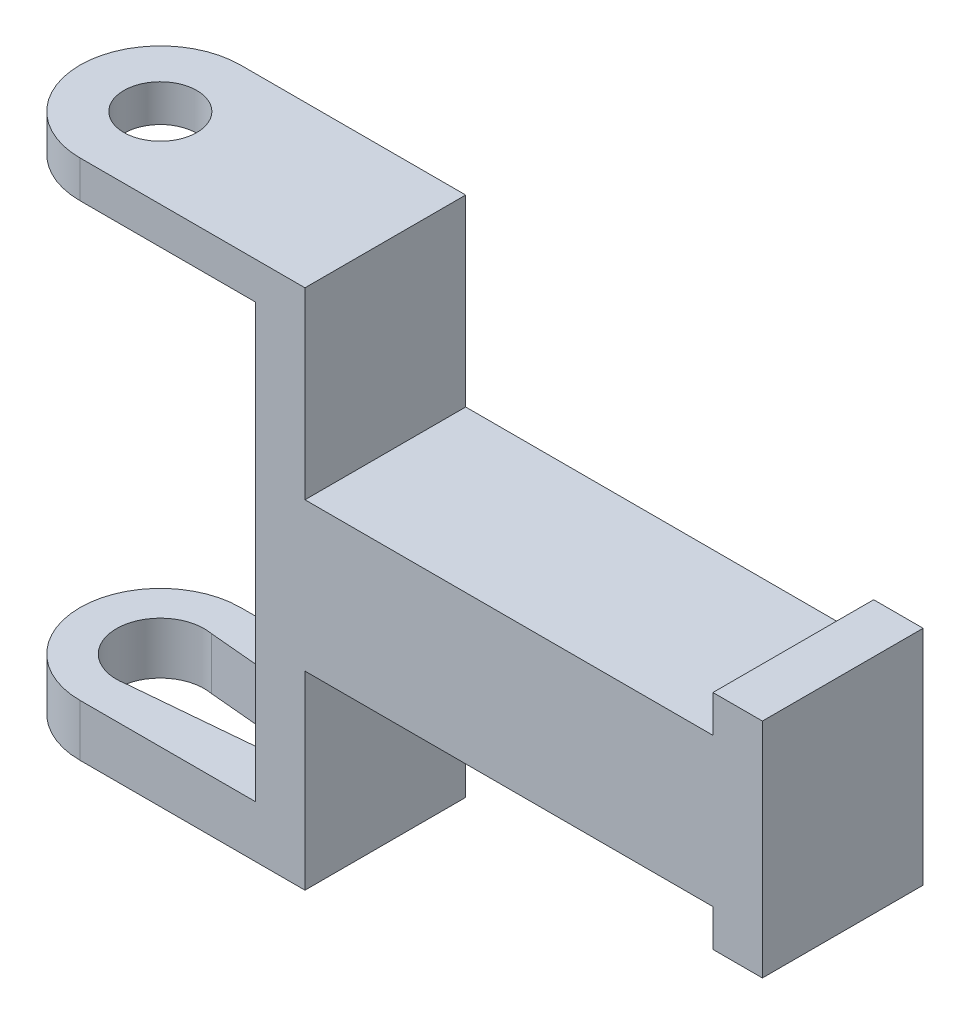
ISO-10303-21;
HEADER;
FILE_DESCRIPTION(('STEP AP214'),'2;1');
FILE_NAME('part.step','',(''),(''),'','','');
FILE_SCHEMA(('AUTOMOTIVE_DESIGN { 1 0 10303 214 1 1 1 1 }'));
ENDSEC;
DATA;
#1=APPLICATION_CONTEXT('core data for automotive mechanical design processes');
#2=APPLICATION_PROTOCOL_DEFINITION('international standard','automotive_design',2000,#1);
#3=PRODUCT_CONTEXT('',#1,'mechanical');
#4=PRODUCT('Part','Part','',(#3));
#5=PRODUCT_RELATED_PRODUCT_CATEGORY('part','',(#4));
#6=PRODUCT_DEFINITION_FORMATION('','',#4);
#7=PRODUCT_DEFINITION_CONTEXT('part definition',#1,'design');
#8=PRODUCT_DEFINITION('design','',#6,#7);
#9=PRODUCT_DEFINITION_SHAPE('','',#8);
#10=(LENGTH_UNIT() NAMED_UNIT(*) SI_UNIT(.MILLI.,.METRE.));
#11=(NAMED_UNIT(*) PLANE_ANGLE_UNIT() SI_UNIT($,.RADIAN.));
#12=(NAMED_UNIT(*) SI_UNIT($,.STERADIAN.) SOLID_ANGLE_UNIT());
#13=UNCERTAINTY_MEASURE_WITH_UNIT(LENGTH_MEASURE(1.E-05),#10,'distance_accuracy_value','');
#14=(GEOMETRIC_REPRESENTATION_CONTEXT(3) GLOBAL_UNCERTAINTY_ASSIGNED_CONTEXT((#13)) GLOBAL_UNIT_ASSIGNED_CONTEXT((#10,
#11,#12)) REPRESENTATION_CONTEXT('',''));
#15=CARTESIAN_POINT('',(0.,0.,0.));
#16=DIRECTION('',(0.,0.,1.));
#17=DIRECTION('',(1.,0.,0.));
#18=AXIS2_PLACEMENT_3D('',#15,#16,#17);
#19=CARTESIAN_POINT('',(-1.,0.,0.));
#20=DIRECTION('',(-1.,0.,0.));
#21=DIRECTION('',(0.,0.,1.));
#22=AXIS2_PLACEMENT_3D('',#19,#20,#21);
#23=PLANE('',#22);
#24=DIRECTION('',(0.,0.,-1.));
#25=VECTOR('',#24,1.);
#26=CARTESIAN_POINT('',(-1.,-74.,0.));
#27=LINE('',#26,#25);
#28=CARTESIAN_POINT('',(-1.,-74.,6.5));
#29=VERTEX_POINT('',#28);
#30=CARTESIAN_POINT('',(-1.,-74.,-6.5));
#31=VERTEX_POINT('',#30);
#32=EDGE_CURVE('E48',#29,#31,#27,.T.);
#33=ORIENTED_EDGE('',*,*,#32,.F.);
#34=DIRECTION('',(0.,-1.,0.));
#35=VECTOR('',#34,1.);
#36=CARTESIAN_POINT('',(-1.,-89.35,6.5));
#37=LINE('',#36,#35);
#38=CARTESIAN_POINT('',(-1.,-89.35,6.5));
#39=VERTEX_POINT('',#38);
#40=EDGE_CURVE('E324',#29,#39,#37,.T.);
#41=ORIENTED_EDGE('',*,*,#40,.T.);
#42=DIRECTION('',(0.,0.,-1.));
#43=VECTOR('',#42,1.);
#44=CARTESIAN_POINT('',(-1.,-89.35,6.5));
#45=LINE('',#44,#43);
#46=CARTESIAN_POINT('',(-1.,-89.35,-6.5));
#47=VERTEX_POINT('',#46);
#48=EDGE_CURVE('E323',#39,#47,#45,.T.);
#49=ORIENTED_EDGE('',*,*,#48,.T.);
#50=DIRECTION('',(0.,1.,0.));
#51=VECTOR('',#50,1.);
#52=CARTESIAN_POINT('',(-1.,-89.35,-6.5));
#53=LINE('',#52,#51);
#54=EDGE_CURVE('E328',#47,#31,#53,.T.);
#55=ORIENTED_EDGE('',*,*,#54,.T.);
#56=EDGE_LOOP('',(#33,#41,#49,#55));
#57=FACE_BOUND('',#56,.T.);
#58=ADVANCED_FACE('F39',(#57),#23,.F.);
#59=DIRECTION('',(0.,0.,1.));
#60=VECTOR('',#59,1.);
#61=CARTESIAN_POINT('',(-1.,-62.,0.));
#62=LINE('',#61,#60);
#63=CARTESIAN_POINT('',(-1.,-62.,-6.5));
#64=VERTEX_POINT('',#63);
#65=CARTESIAN_POINT('',(-1.,-62.,6.5));
#66=VERTEX_POINT('',#65);
#67=EDGE_CURVE('E366',#64,#66,#62,.T.);
#68=ORIENTED_EDGE('',*,*,#67,.F.);
#69=CARTESIAN_POINT('',(-1.,-47.15,-6.5));
#70=VERTEX_POINT('',#69);
#71=EDGE_CURVE('E327',#64,#70,#53,.T.);
#72=ORIENTED_EDGE('',*,*,#71,.T.);
#73=DIRECTION('',(0.,0.,1.));
#74=VECTOR('',#73,1.);
#75=CARTESIAN_POINT('',(-1.,-47.15,6.5));
#76=LINE('',#75,#74);
#77=CARTESIAN_POINT('',(-1.,-47.15,6.5));
#78=VERTEX_POINT('',#77);
#79=EDGE_CURVE('E332',#70,#78,#76,.T.);
#80=ORIENTED_EDGE('',*,*,#79,.T.);
#81=EDGE_CURVE('E319',#78,#66,#37,.T.);
#82=ORIENTED_EDGE('',*,*,#81,.T.);
#83=EDGE_LOOP('',(#68,#72,#80,#82));
#84=FACE_BOUND('',#83,.T.);
#85=ADVANCED_FACE('F386',(#84),#23,.F.);
#86=CARTESIAN_POINT('',(-5.,0.,0.));
#87=DIRECTION('',(-1.,0.,0.));
#88=DIRECTION('',(0.,0.,1.));
#89=AXIS2_PLACEMENT_3D('',#86,#87,#88);
#90=PLANE('',#89);
#91=DIRECTION('',(0.,0.,1.));
#92=VECTOR('',#91,1.);
#93=CARTESIAN_POINT('',(-5.,-50.15,0.));
#94=LINE('',#93,#92);
#95=CARTESIAN_POINT('',(-5.,-50.15,-6.5));
#96=VERTEX_POINT('',#95);
#97=CARTESIAN_POINT('',(-5.,-50.15,6.5));
#98=VERTEX_POINT('',#97);
#99=EDGE_CURVE('E254',#96,#98,#94,.T.);
#100=ORIENTED_EDGE('',*,*,#99,.F.);
#101=DIRECTION('',(0.,1.,0.));
#102=VECTOR('',#101,1.);
#103=CARTESIAN_POINT('',(-5.,-89.35,-6.5));
#104=LINE('',#103,#102);
#105=CARTESIAN_POINT('',(-5.,-85.15,-6.5));
#106=VERTEX_POINT('',#105);
#107=EDGE_CURVE('E338',#106,#96,#104,.T.);
#108=ORIENTED_EDGE('',*,*,#107,.F.);
#109=DIRECTION('',(0.,0.,1.));
#110=VECTOR('',#109,1.);
#111=CARTESIAN_POINT('',(-5.,-85.15,0.));
#112=LINE('',#111,#110);
#113=CARTESIAN_POINT('',(-5.,-85.15,6.5));
#114=VERTEX_POINT('',#113);
#115=EDGE_CURVE('E354',#106,#114,#112,.T.);
#116=ORIENTED_EDGE('',*,*,#115,.T.);
#117=DIRECTION('',(0.,-1.,0.));
#118=VECTOR('',#117,1.);
#119=CARTESIAN_POINT('',(-5.,-89.35,6.5));
#120=LINE('',#119,#118);
#121=EDGE_CURVE('E318',#98,#114,#120,.T.);
#122=ORIENTED_EDGE('',*,*,#121,.F.);
#123=EDGE_LOOP('',(#100,#108,#116,#122));
#124=FACE_BOUND('',#123,.T.);
#125=ADVANCED_FACE('F442',(#124),#90,.T.);
#126=CARTESIAN_POINT('',(-1.,-89.35,6.5));
#127=DIRECTION('',(0.,0.,-1.));
#128=DIRECTION('',(-1.,0.,0.));
#129=AXIS2_PLACEMENT_3D('',#126,#127,#128);
#130=PLANE('',#129);
#131=DIRECTION('',(-1.,0.,0.));
#132=VECTOR('',#131,1.);
#133=CARTESIAN_POINT('',(36.,-74.,6.5));
#134=LINE('',#133,#132);
#135=CARTESIAN_POINT('',(32.,-74.,6.5));
#136=VERTEX_POINT('',#135);
#137=EDGE_CURVE('E221',#136,#29,#134,.T.);
#138=ORIENTED_EDGE('',*,*,#137,.F.);
#139=DIRECTION('',(0.,-1.,0.));
#140=VECTOR('',#139,1.);
#141=CARTESIAN_POINT('',(32.,-77.,6.5));
#142=LINE('',#141,#140);
#143=CARTESIAN_POINT('',(32.,-77.,6.5));
#144=VERTEX_POINT('',#143);
#145=EDGE_CURVE('E55',#136,#144,#142,.T.);
#146=ORIENTED_EDGE('',*,*,#145,.T.);
#147=DIRECTION('',(-1.,0.,0.));
#148=VECTOR('',#147,1.);
#149=CARTESIAN_POINT('',(36.,-77.,6.5));
#150=LINE('',#149,#148);
#151=CARTESIAN_POINT('',(36.,-77.,6.5));
#152=VERTEX_POINT('',#151);
#153=EDGE_CURVE('E194',#152,#144,#150,.T.);
#154=ORIENTED_EDGE('',*,*,#153,.F.);
#155=DIRECTION('',(0.,-1.,0.));
#156=VECTOR('',#155,1.);
#157=CARTESIAN_POINT('',(36.,-74.,6.5));
#158=LINE('',#157,#156);
#159=CARTESIAN_POINT('',(36.,-59.,6.5));
#160=VERTEX_POINT('',#159);
#161=EDGE_CURVE('E176',#160,#152,#158,.T.);
#162=ORIENTED_EDGE('',*,*,#161,.F.);
#163=DIRECTION('',(-1.,0.,0.));
#164=VECTOR('',#163,1.);
#165=CARTESIAN_POINT('',(36.,-59.,6.5));
#166=LINE('',#165,#164);
#167=CARTESIAN_POINT('',(32.,-59.,6.5));
#168=VERTEX_POINT('',#167);
#169=EDGE_CURVE('E411',#160,#168,#166,.T.);
#170=ORIENTED_EDGE('',*,*,#169,.T.);
#171=CARTESIAN_POINT('',(32.,-62.,6.5));
#172=VERTEX_POINT('',#171);
#173=EDGE_CURVE('E414',#168,#172,#142,.T.);
#174=ORIENTED_EDGE('',*,*,#173,.T.);
#175=DIRECTION('',(-1.,0.,0.));
#176=VECTOR('',#175,1.);
#177=CARTESIAN_POINT('',(36.,-62.,6.5));
#178=LINE('',#177,#176);
#179=EDGE_CURVE('E212',#172,#66,#178,.T.);
#180=ORIENTED_EDGE('',*,*,#179,.T.);
#181=ORIENTED_EDGE('',*,*,#81,.F.);
#182=DIRECTION('',(-1.,0.,0.));
#183=VECTOR('',#182,1.);
#184=CARTESIAN_POINT('',(-1.,-47.15,6.5));
#185=LINE('',#184,#183);
#186=CARTESIAN_POINT('',(-19.2,-47.15,6.5));
#187=VERTEX_POINT('',#186);
#188=EDGE_CURVE('E335',#78,#187,#185,.T.);
#189=ORIENTED_EDGE('',*,*,#188,.T.);
#190=DIRECTION('',(0.,-1.,0.));
#191=VECTOR('',#190,1.);
#192=CARTESIAN_POINT('',(-19.2,-47.15,6.5));
#193=LINE('',#192,#191);
#194=CARTESIAN_POINT('',(-19.2,-50.15,6.5));
#195=VERTEX_POINT('',#194);
#196=EDGE_CURVE('E251',#187,#195,#193,.T.);
#197=ORIENTED_EDGE('',*,*,#196,.T.);
#198=DIRECTION('',(1.,0.,0.));
#199=VECTOR('',#198,1.);
#200=CARTESIAN_POINT('',(-19.2,-50.15,6.5));
#201=LINE('',#200,#199);
#202=EDGE_CURVE('E237',#195,#98,#201,.T.);
#203=ORIENTED_EDGE('',*,*,#202,.T.);
#204=ORIENTED_EDGE('',*,*,#121,.T.);
#205=DIRECTION('',(1.,0.,0.));
#206=VECTOR('',#205,1.);
#207=CARTESIAN_POINT('',(-19.2,-85.15,6.5));
#208=LINE('',#207,#206);
#209=CARTESIAN_POINT('',(-19.2,-85.15,6.5));
#210=VERTEX_POINT('',#209);
#211=EDGE_CURVE('E301',#210,#114,#208,.T.);
#212=ORIENTED_EDGE('',*,*,#211,.F.);
#213=DIRECTION('',(0.,-1.,0.));
#214=VECTOR('',#213,1.);
#215=CARTESIAN_POINT('',(-19.2,-85.15,6.5));
#216=LINE('',#215,#214);
#217=CARTESIAN_POINT('',(-19.2,-89.35,6.5));
#218=VERTEX_POINT('',#217);
#219=EDGE_CURVE('E315',#210,#218,#216,.T.);
#220=ORIENTED_EDGE('',*,*,#219,.T.);
#221=DIRECTION('',(-1.,0.,0.));
#222=VECTOR('',#221,1.);
#223=CARTESIAN_POINT('',(-1.,-89.35,6.5));
#224=LINE('',#223,#222);
#225=EDGE_CURVE('E350',#39,#218,#224,.T.);
#226=ORIENTED_EDGE('',*,*,#225,.F.);
#227=ORIENTED_EDGE('',*,*,#40,.F.);
#228=EDGE_LOOP('',(#138,#146,#154,#162,#170,#174,#180,#181,#189,#197,#203,#204,#212,#220,#226,#227));
#229=FACE_BOUND('',#228,.T.);
#230=ADVANCED_FACE('F41',(#229),#130,.F.);
#231=CARTESIAN_POINT('',(-1.,-89.35,6.5));
#232=DIRECTION('',(0.,1.,0.));
#233=DIRECTION('',(0.,0.,1.));
#234=AXIS2_PLACEMENT_3D('',#231,#232,#233);
#235=PLANE('',#234);
#236=DIRECTION('',(0.,0.,-1.));
#237=VECTOR('',#236,1.);
#238=CARTESIAN_POINT('',(-6.5,-89.35,2.40328140539589));
#239=LINE('',#238,#237);
#240=CARTESIAN_POINT('',(-6.5,-89.35,2.40328140539589));
#241=VERTEX_POINT('',#240);
#242=CARTESIAN_POINT('',(-6.5,-89.35,-2.40328140539589));
#243=VERTEX_POINT('',#242);
#244=EDGE_CURVE('E263',#241,#243,#239,.T.);
#245=ORIENTED_EDGE('',*,*,#244,.T.);
#246=DIRECTION('',(-0.995948362239352,0.,-0.0899269689956986));
#247=VECTOR('',#246,1.);
#248=CARTESIAN_POINT('',(-6.5,-89.35,-2.40328140539589));
#249=LINE('',#248,#247);
#250=CARTESIAN_POINT('',(-18.5641054158038,-89.35,-3.49258329575545));
#251=VERTEX_POINT('',#250);
#252=EDGE_CURVE('E268',#243,#251,#249,.T.);
#253=ORIENTED_EDGE('',*,*,#252,.T.);
#254=CARTESIAN_POINT('',(-19.2,-89.35,0.));
#255=DIRECTION('',(0.,1.,0.));
#256=DIRECTION('',(0.,0.,1.));
#257=AXIS2_PLACEMENT_3D('',#254,#255,#256);
#258=CIRCLE('',#257,3.55);
#259=CARTESIAN_POINT('',(-18.5641054158038,-89.35,3.49258329575545));
#260=VERTEX_POINT('',#259);
#261=EDGE_CURVE('E289',#251,#260,#258,.T.);
#262=ORIENTED_EDGE('',*,*,#261,.T.);
#263=DIRECTION('',(0.995948362239352,0.,-0.0899269689956986));
#264=VECTOR('',#263,1.);
#265=CARTESIAN_POINT('',(-19.2,-89.35,3.55));
#266=LINE('',#265,#264);
#267=EDGE_CURVE('E259',#260,#241,#266,.T.);
#268=ORIENTED_EDGE('',*,*,#267,.T.);
#269=EDGE_LOOP('',(#245,#253,#262,#268));
#270=FACE_BOUND('',#269,.T.);
#271=ORIENTED_EDGE('',*,*,#225,.T.);
#272=CARTESIAN_POINT('',(-19.2,-89.35,0.));
#273=DIRECTION('',(0.,1.,0.));
#274=DIRECTION('',(0.,0.,1.));
#275=AXIS2_PLACEMENT_3D('',#272,#273,#274);
#276=CIRCLE('',#275,6.5);
#277=CARTESIAN_POINT('',(-19.2,-89.35,-6.5));
#278=VERTEX_POINT('',#277);
#279=EDGE_CURVE('E293',#278,#218,#276,.T.);
#280=ORIENTED_EDGE('',*,*,#279,.F.);
#281=DIRECTION('',(-1.,0.,0.));
#282=VECTOR('',#281,1.);
#283=CARTESIAN_POINT('',(-1.,-89.35,-6.5));
#284=LINE('',#283,#282);
#285=EDGE_CURVE('E347',#47,#278,#284,.T.);
#286=ORIENTED_EDGE('',*,*,#285,.F.);
#287=ORIENTED_EDGE('',*,*,#48,.F.);
#288=EDGE_LOOP('',(#271,#280,#286,#287));
#289=FACE_BOUND('',#288,.T.);
#290=ADVANCED_FACE('F454',(#270,#289),#235,.F.);
#291=CARTESIAN_POINT('',(-1.,-89.35,-6.5));
#292=DIRECTION('',(0.,0.,1.));
#293=DIRECTION('',(1.,0.,0.));
#294=AXIS2_PLACEMENT_3D('',#291,#292,#293);
#295=PLANE('',#294);
#296=DIRECTION('',(-1.,0.,0.));
#297=VECTOR('',#296,1.);
#298=CARTESIAN_POINT('',(36.,-62.,-6.5));
#299=LINE('',#298,#297);
#300=CARTESIAN_POINT('',(32.,-62.,-6.5));
#301=VERTEX_POINT('',#300);
#302=EDGE_CURVE('E215',#301,#64,#299,.T.);
#303=ORIENTED_EDGE('',*,*,#302,.F.);
#304=DIRECTION('',(0.,1.,0.));
#305=VECTOR('',#304,1.);
#306=CARTESIAN_POINT('',(32.,-77.,-6.5));
#307=LINE('',#306,#305);
#308=CARTESIAN_POINT('',(32.,-59.,-6.5));
#309=VERTEX_POINT('',#308);
#310=EDGE_CURVE('E63',#301,#309,#307,.T.);
#311=ORIENTED_EDGE('',*,*,#310,.T.);
#312=DIRECTION('',(-1.,0.,0.));
#313=VECTOR('',#312,1.);
#314=CARTESIAN_POINT('',(36.,-59.,-6.5));
#315=LINE('',#314,#313);
#316=CARTESIAN_POINT('',(36.,-59.,-6.5));
#317=VERTEX_POINT('',#316);
#318=EDGE_CURVE('E206',#317,#309,#315,.T.);
#319=ORIENTED_EDGE('',*,*,#318,.F.);
#320=DIRECTION('',(0.,1.,0.));
#321=VECTOR('',#320,1.);
#322=CARTESIAN_POINT('',(36.,-74.,-6.5));
#323=LINE('',#322,#321);
#324=CARTESIAN_POINT('',(36.,-77.,-6.5));
#325=VERTEX_POINT('',#324);
#326=EDGE_CURVE('E188',#325,#317,#323,.T.);
#327=ORIENTED_EDGE('',*,*,#326,.F.);
#328=DIRECTION('',(-1.,0.,0.));
#329=VECTOR('',#328,1.);
#330=CARTESIAN_POINT('',(36.,-77.,-6.5));
#331=LINE('',#330,#329);
#332=CARTESIAN_POINT('',(32.,-77.,-6.5));
#333=VERTEX_POINT('',#332);
#334=EDGE_CURVE('E196',#325,#333,#331,.T.);
#335=ORIENTED_EDGE('',*,*,#334,.T.);
#336=CARTESIAN_POINT('',(32.,-74.,-6.5));
#337=VERTEX_POINT('',#336);
#338=EDGE_CURVE('E405',#333,#337,#307,.T.);
#339=ORIENTED_EDGE('',*,*,#338,.T.);
#340=DIRECTION('',(-1.,0.,0.));
#341=VECTOR('',#340,1.);
#342=CARTESIAN_POINT('',(36.,-74.,-6.5));
#343=LINE('',#342,#341);
#344=EDGE_CURVE('E218',#337,#31,#343,.T.);
#345=ORIENTED_EDGE('',*,*,#344,.T.);
#346=ORIENTED_EDGE('',*,*,#54,.F.);
#347=ORIENTED_EDGE('',*,*,#285,.T.);
#348=DIRECTION('',(0.,-1.,0.));
#349=VECTOR('',#348,1.);
#350=CARTESIAN_POINT('',(-19.2,-85.15,-6.5));
#351=LINE('',#350,#349);
#352=CARTESIAN_POINT('',(-19.2,-85.15,-6.5));
#353=VERTEX_POINT('',#352);
#354=EDGE_CURVE('E311',#353,#278,#351,.T.);
#355=ORIENTED_EDGE('',*,*,#354,.F.);
#356=DIRECTION('',(-1.,0.,0.));
#357=VECTOR('',#356,1.);
#358=CARTESIAN_POINT('',(-19.2,-85.15,-6.5));
#359=LINE('',#358,#357);
#360=EDGE_CURVE('E308',#106,#353,#359,.T.);
#361=ORIENTED_EDGE('',*,*,#360,.F.);
#362=ORIENTED_EDGE('',*,*,#107,.T.);
#363=DIRECTION('',(-1.,0.,0.));
#364=VECTOR('',#363,1.);
#365=CARTESIAN_POINT('',(-19.2,-50.15,-6.5));
#366=LINE('',#365,#364);
#367=CARTESIAN_POINT('',(-19.2,-50.15,-6.5));
#368=VERTEX_POINT('',#367);
#369=EDGE_CURVE('E244',#96,#368,#366,.T.);
#370=ORIENTED_EDGE('',*,*,#369,.T.);
#371=DIRECTION('',(0.,-1.,0.));
#372=VECTOR('',#371,1.);
#373=CARTESIAN_POINT('',(-19.2,-47.15,-6.5));
#374=LINE('',#373,#372);
#375=CARTESIAN_POINT('',(-19.2,-47.15,-6.5));
#376=VERTEX_POINT('',#375);
#377=EDGE_CURVE('E247',#376,#368,#374,.T.);
#378=ORIENTED_EDGE('',*,*,#377,.F.);
#379=DIRECTION('',(-1.,0.,0.));
#380=VECTOR('',#379,1.);
#381=CARTESIAN_POINT('',(-1.,-47.15,-6.5));
#382=LINE('',#381,#380);
#383=EDGE_CURVE('E344',#70,#376,#382,.T.);
#384=ORIENTED_EDGE('',*,*,#383,.F.);
#385=ORIENTED_EDGE('',*,*,#71,.F.);
#386=EDGE_LOOP('',(#303,#311,#319,#327,#335,#339,#345,#346,#347,#355,#361,#362,#370,#378,#384,#385));
#387=FACE_BOUND('',#386,.T.);
#388=ADVANCED_FACE('F392',(#387),#295,.F.);
#389=CARTESIAN_POINT('',(-1.,-47.15,6.5));
#390=DIRECTION('',(0.,-1.,0.));
#391=DIRECTION('',(0.,0.,-1.));
#392=AXIS2_PLACEMENT_3D('',#389,#390,#391);
#393=PLANE('',#392);
#394=CARTESIAN_POINT('',(-19.2,-47.15,0.));
#395=DIRECTION('',(0.,1.,0.));
#396=DIRECTION('',(0.,0.,1.));
#397=AXIS2_PLACEMENT_3D('',#394,#395,#396);
#398=CIRCLE('',#397,2.95);
#399=CARTESIAN_POINT('',(-19.2,-47.15,2.95));
#400=VERTEX_POINT('',#399);
#401=EDGE_CURVE('E224',#400,#400,#398,.T.);
#402=ORIENTED_EDGE('',*,*,#401,.F.);
#403=EDGE_LOOP('',(#402));
#404=FACE_BOUND('',#403,.T.);
#405=ORIENTED_EDGE('',*,*,#383,.T.);
#406=CARTESIAN_POINT('',(-19.2,-47.15,0.));
#407=DIRECTION('',(0.,1.,0.));
#408=DIRECTION('',(0.,0.,1.));
#409=AXIS2_PLACEMENT_3D('',#406,#407,#408);
#410=CIRCLE('',#409,6.5);
#411=EDGE_CURVE('E233',#376,#187,#410,.T.);
#412=ORIENTED_EDGE('',*,*,#411,.T.);
#413=ORIENTED_EDGE('',*,*,#188,.F.);
#414=ORIENTED_EDGE('',*,*,#79,.F.);
#415=EDGE_LOOP('',(#405,#412,#413,#414));
#416=FACE_BOUND('',#415,.T.);
#417=ADVANCED_FACE('F395',(#404,#416),#393,.F.);
#418=CARTESIAN_POINT('',(0.,-85.15,0.));
#419=DIRECTION('',(0.,-1.,0.));
#420=DIRECTION('',(0.,0.,-1.));
#421=AXIS2_PLACEMENT_3D('',#418,#419,#420);
#422=PLANE('',#421);
#423=CARTESIAN_POINT('',(-19.2,-85.15,0.));
#424=DIRECTION('',(0.,1.,0.));
#425=DIRECTION('',(0.,0.,1.));
#426=AXIS2_PLACEMENT_3D('',#423,#424,#425);
#427=CIRCLE('',#426,3.55);
#428=CARTESIAN_POINT('',(-18.5641054158038,-85.15,-3.49258329575545));
#429=VERTEX_POINT('',#428);
#430=CARTESIAN_POINT('',(-18.5641054158038,-85.15,3.49258329575545));
#431=VERTEX_POINT('',#430);
#432=EDGE_CURVE('E285',#429,#431,#427,.T.);
#433=ORIENTED_EDGE('',*,*,#432,.F.);
#434=DIRECTION('',(-0.995948362239352,0.,-0.0899269689956986));
#435=VECTOR('',#434,1.);
#436=CARTESIAN_POINT('',(-6.5,-85.15,-2.40328140539589));
#437=LINE('',#436,#435);
#438=CARTESIAN_POINT('',(-6.5,-85.15,-2.40328140539589));
#439=VERTEX_POINT('',#438);
#440=EDGE_CURVE('E264',#439,#429,#437,.T.);
#441=ORIENTED_EDGE('',*,*,#440,.F.);
#442=DIRECTION('',(0.,0.,-1.));
#443=VECTOR('',#442,1.);
#444=CARTESIAN_POINT('',(-6.5,-85.15,2.40328140539589));
#445=LINE('',#444,#443);
#446=CARTESIAN_POINT('',(-6.5,-85.15,2.40328140539589));
#447=VERTEX_POINT('',#446);
#448=EDGE_CURVE('E275',#447,#439,#445,.T.);
#449=ORIENTED_EDGE('',*,*,#448,.F.);
#450=DIRECTION('',(0.995948362239352,0.,-0.0899269689956986));
#451=VECTOR('',#450,1.);
#452=CARTESIAN_POINT('',(-19.2,-85.15,3.55));
#453=LINE('',#452,#451);
#454=EDGE_CURVE('E258',#431,#447,#453,.T.);
#455=ORIENTED_EDGE('',*,*,#454,.F.);
#456=EDGE_LOOP('',(#433,#441,#449,#455));
#457=FACE_BOUND('',#456,.T.);
#458=ORIENTED_EDGE('',*,*,#360,.T.);
#459=CARTESIAN_POINT('',(-19.2,-85.15,0.));
#460=DIRECTION('',(0.,1.,0.));
#461=DIRECTION('',(0.,0.,1.));
#462=AXIS2_PLACEMENT_3D('',#459,#460,#461);
#463=CIRCLE('',#462,6.5);
#464=EDGE_CURVE('E297',#353,#210,#463,.T.);
#465=ORIENTED_EDGE('',*,*,#464,.T.);
#466=ORIENTED_EDGE('',*,*,#211,.T.);
#467=ORIENTED_EDGE('',*,*,#115,.F.);
#468=EDGE_LOOP('',(#458,#465,#466,#467));
#469=FACE_BOUND('',#468,.T.);
#470=ADVANCED_FACE('F445',(#457,#469),#422,.F.);
#471=CARTESIAN_POINT('',(-19.2,-85.15,0.));
#472=DIRECTION('',(0.,-1.,0.));
#473=DIRECTION('',(0.,0.,-1.));
#474=AXIS2_PLACEMENT_3D('',#471,#472,#473);
#475=CYLINDRICAL_SURFACE('',#474,6.5);
#476=ORIENTED_EDGE('',*,*,#279,.T.);
#477=ORIENTED_EDGE('',*,*,#219,.F.);
#478=ORIENTED_EDGE('',*,*,#464,.F.);
#479=ORIENTED_EDGE('',*,*,#354,.T.);
#480=EDGE_LOOP('',(#476,#477,#478,#479));
#481=FACE_BOUND('',#480,.T.);
#482=ADVANCED_FACE('F466',(#481),#475,.T.);
#483=CARTESIAN_POINT('',(-19.2,-89.35,0.));
#484=DIRECTION('',(0.,1.,0.));
#485=DIRECTION('',(0.,0.,1.));
#486=AXIS2_PLACEMENT_3D('',#483,#484,#485);
#487=CYLINDRICAL_SURFACE('',#486,3.55);
#488=ORIENTED_EDGE('',*,*,#432,.T.);
#489=DIRECTION('',(0.,1.,0.));
#490=VECTOR('',#489,1.);
#491=CARTESIAN_POINT('',(-18.5641054158038,-89.35,3.49258329575545));
#492=LINE('',#491,#490);
#493=EDGE_CURVE('E358',#431,#260,#492,.F.);
#494=ORIENTED_EDGE('',*,*,#493,.T.);
#495=ORIENTED_EDGE('',*,*,#261,.F.);
#496=DIRECTION('',(0.,1.,0.));
#497=VECTOR('',#496,1.);
#498=CARTESIAN_POINT('',(-18.5641054158038,-89.35,-3.49258329575545));
#499=LINE('',#498,#497);
#500=EDGE_CURVE('E362',#251,#429,#499,.T.);
#501=ORIENTED_EDGE('',*,*,#500,.T.);
#502=EDGE_LOOP('',(#488,#494,#495,#501));
#503=FACE_BOUND('',#502,.T.);
#504=ADVANCED_FACE('F497',(#503),#487,.F.);
#505=CARTESIAN_POINT('',(-6.5,-89.35,-2.40328140539589));
#506=DIRECTION('',(0.0899269689956986,0.,-0.995948362239351));
#507=DIRECTION('',(-0.995948362239352,0.,-0.0899269689956986));
#508=AXIS2_PLACEMENT_3D('',#505,#506,#507);
#509=PLANE('',#508);
#510=ORIENTED_EDGE('',*,*,#252,.F.);
#511=DIRECTION('',(0.,1.,0.));
#512=VECTOR('',#511,1.);
#513=CARTESIAN_POINT('',(-6.5,-89.35,-2.40328140539589));
#514=LINE('',#513,#512);
#515=EDGE_CURVE('E282',#243,#439,#514,.T.);
#516=ORIENTED_EDGE('',*,*,#515,.T.);
#517=ORIENTED_EDGE('',*,*,#440,.T.);
#518=ORIENTED_EDGE('',*,*,#500,.F.);
#519=EDGE_LOOP('',(#510,#516,#517,#518));
#520=FACE_BOUND('',#519,.T.);
#521=ADVANCED_FACE('F493',(#520),#509,.F.);
#522=CARTESIAN_POINT('',(-19.2,-89.35,3.55));
#523=DIRECTION('',(0.0899269689956986,0.,0.995948362239351));
#524=DIRECTION('',(0.995948362239352,0.,-0.0899269689956986));
#525=AXIS2_PLACEMENT_3D('',#522,#523,#524);
#526=PLANE('',#525);
#527=ORIENTED_EDGE('',*,*,#454,.T.);
#528=DIRECTION('',(0.,1.,0.));
#529=VECTOR('',#528,1.);
#530=CARTESIAN_POINT('',(-6.5,-89.35,2.40328140539589));
#531=LINE('',#530,#529);
#532=EDGE_CURVE('E272',#241,#447,#531,.T.);
#533=ORIENTED_EDGE('',*,*,#532,.F.);
#534=ORIENTED_EDGE('',*,*,#267,.F.);
#535=ORIENTED_EDGE('',*,*,#493,.F.);
#536=EDGE_LOOP('',(#527,#533,#534,#535));
#537=FACE_BOUND('',#536,.T.);
#538=ADVANCED_FACE('F496',(#537),#526,.F.);
#539=CARTESIAN_POINT('',(-6.5,-89.35,2.40328140539589));
#540=DIRECTION('',(1.,0.,0.));
#541=DIRECTION('',(0.,0.,-1.));
#542=AXIS2_PLACEMENT_3D('',#539,#540,#541);
#543=PLANE('',#542);
#544=ORIENTED_EDGE('',*,*,#448,.T.);
#545=ORIENTED_EDGE('',*,*,#515,.F.);
#546=ORIENTED_EDGE('',*,*,#244,.F.);
#547=ORIENTED_EDGE('',*,*,#532,.T.);
#548=EDGE_LOOP('',(#544,#545,#546,#547));
#549=FACE_BOUND('',#548,.T.);
#550=ADVANCED_FACE('F488',(#549),#543,.F.);
#551=CARTESIAN_POINT('',(0.,-50.15,0.));
#552=DIRECTION('',(0.,-1.,0.));
#553=DIRECTION('',(0.,0.,-1.));
#554=AXIS2_PLACEMENT_3D('',#551,#552,#553);
#555=PLANE('',#554);
#556=CARTESIAN_POINT('',(-19.2,-50.15,0.));
#557=DIRECTION('',(0.,1.,0.));
#558=DIRECTION('',(0.,0.,1.));
#559=AXIS2_PLACEMENT_3D('',#556,#557,#558);
#560=CIRCLE('',#559,2.95);
#561=CARTESIAN_POINT('',(-19.2,-50.15,2.95));
#562=VERTEX_POINT('',#561);
#563=EDGE_CURVE('E225',#562,#562,#560,.T.);
#564=ORIENTED_EDGE('',*,*,#563,.T.);
#565=EDGE_LOOP('',(#564));
#566=FACE_BOUND('',#565,.T.);
#567=ORIENTED_EDGE('',*,*,#202,.F.);
#568=CARTESIAN_POINT('',(-19.2,-50.15,0.));
#569=DIRECTION('',(0.,1.,0.));
#570=DIRECTION('',(0.,0.,1.));
#571=AXIS2_PLACEMENT_3D('',#568,#569,#570);
#572=CIRCLE('',#571,6.5);
#573=EDGE_CURVE('E229',#368,#195,#572,.T.);
#574=ORIENTED_EDGE('',*,*,#573,.F.);
#575=ORIENTED_EDGE('',*,*,#369,.F.);
#576=ORIENTED_EDGE('',*,*,#99,.T.);
#577=EDGE_LOOP('',(#567,#574,#575,#576));
#578=FACE_BOUND('',#577,.T.);
#579=ADVANCED_FACE('F475',(#566,#578),#555,.T.);
#580=CARTESIAN_POINT('',(-19.2,-47.15,0.));
#581=DIRECTION('',(0.,-1.,0.));
#582=DIRECTION('',(0.,0.,-1.));
#583=AXIS2_PLACEMENT_3D('',#580,#581,#582);
#584=CYLINDRICAL_SURFACE('',#583,6.5);
#585=ORIENTED_EDGE('',*,*,#573,.T.);
#586=ORIENTED_EDGE('',*,*,#196,.F.);
#587=ORIENTED_EDGE('',*,*,#411,.F.);
#588=ORIENTED_EDGE('',*,*,#377,.T.);
#589=EDGE_LOOP('',(#585,#586,#587,#588));
#590=FACE_BOUND('',#589,.T.);
#591=ADVANCED_FACE('F478',(#590),#584,.T.);
#592=CARTESIAN_POINT('',(-19.2,-50.15,0.));
#593=DIRECTION('',(0.,1.,0.));
#594=DIRECTION('',(0.,0.,1.));
#595=AXIS2_PLACEMENT_3D('',#592,#593,#594);
#596=CYLINDRICAL_SURFACE('',#595,2.95);
#597=ORIENTED_EDGE('',*,*,#563,.F.);
#598=EDGE_LOOP('',(#597));
#599=FACE_BOUND('',#598,.T.);
#600=ORIENTED_EDGE('',*,*,#401,.T.);
#601=EDGE_LOOP('',(#600));
#602=FACE_BOUND('',#601,.T.);
#603=ADVANCED_FACE('F480',(#599,#602),#596,.F.);
#604=CARTESIAN_POINT('',(36.,-74.,6.5));
#605=DIRECTION('',(0.,1.,0.));
#606=DIRECTION('',(0.,0.,1.));
#607=AXIS2_PLACEMENT_3D('',#604,#605,#606);
#608=PLANE('',#607);
#609=ORIENTED_EDGE('',*,*,#344,.F.);
#610=DIRECTION('',(0.,0.,1.));
#611=VECTOR('',#610,1.);
#612=CARTESIAN_POINT('',(32.,-74.,6.5));
#613=LINE('',#612,#611);
#614=EDGE_CURVE('E189',#337,#136,#613,.T.);
#615=ORIENTED_EDGE('',*,*,#614,.T.);
#616=ORIENTED_EDGE('',*,*,#137,.T.);
#617=ORIENTED_EDGE('',*,*,#32,.T.);
#618=EDGE_LOOP('',(#609,#615,#616,#617));
#619=FACE_BOUND('',#618,.T.);
#620=ADVANCED_FACE('F374',(#619),#608,.F.);
#621=CARTESIAN_POINT('',(36.,-62.,6.5));
#622=DIRECTION('',(0.,-1.,0.));
#623=DIRECTION('',(0.,0.,-1.));
#624=AXIS2_PLACEMENT_3D('',#621,#622,#623);
#625=PLANE('',#624);
#626=ORIENTED_EDGE('',*,*,#179,.F.);
#627=DIRECTION('',(0.,0.,-1.));
#628=VECTOR('',#627,1.);
#629=CARTESIAN_POINT('',(32.,-62.,6.5));
#630=LINE('',#629,#628);
#631=EDGE_CURVE('E11',#172,#301,#630,.T.);
#632=ORIENTED_EDGE('',*,*,#631,.T.);
#633=ORIENTED_EDGE('',*,*,#302,.T.);
#634=ORIENTED_EDGE('',*,*,#67,.T.);
#635=EDGE_LOOP('',(#626,#632,#633,#634));
#636=FACE_BOUND('',#635,.T.);
#637=ADVANCED_FACE('F401',(#636),#625,.F.);
#638=CARTESIAN_POINT('',(36.,0.,0.));
#639=DIRECTION('',(-1.,0.,0.));
#640=DIRECTION('',(0.,0.,1.));
#641=AXIS2_PLACEMENT_3D('',#638,#639,#640);
#642=PLANE('',#641);
#643=ORIENTED_EDGE('',*,*,#161,.T.);
#644=DIRECTION('',(0.,0.,-1.));
#645=VECTOR('',#644,1.);
#646=CARTESIAN_POINT('',(36.,-77.,6.5));
#647=LINE('',#646,#645);
#648=EDGE_CURVE('E179',#152,#325,#647,.T.);
#649=ORIENTED_EDGE('',*,*,#648,.T.);
#650=ORIENTED_EDGE('',*,*,#326,.T.);
#651=DIRECTION('',(0.,0.,1.));
#652=VECTOR('',#651,1.);
#653=CARTESIAN_POINT('',(36.,-59.,6.5));
#654=LINE('',#653,#652);
#655=EDGE_CURVE('E182',#317,#160,#654,.T.);
#656=ORIENTED_EDGE('',*,*,#655,.T.);
#657=EDGE_LOOP('',(#643,#649,#650,#656));
#658=FACE_BOUND('',#657,.T.);
#659=ADVANCED_FACE('F178',(#658),#642,.F.);
#660=CARTESIAN_POINT('',(36.,-59.,6.5));
#661=DIRECTION('',(0.,-1.,0.));
#662=DIRECTION('',(0.,0.,-1.));
#663=AXIS2_PLACEMENT_3D('',#660,#661,#662);
#664=PLANE('',#663);
#665=DIRECTION('',(0.,0.,1.));
#666=VECTOR('',#665,1.);
#667=CARTESIAN_POINT('',(32.,-59.,6.5));
#668=LINE('',#667,#666);
#669=EDGE_CURVE('E198',#309,#168,#668,.T.);
#670=ORIENTED_EDGE('',*,*,#669,.T.);
#671=ORIENTED_EDGE('',*,*,#169,.F.);
#672=ORIENTED_EDGE('',*,*,#655,.F.);
#673=ORIENTED_EDGE('',*,*,#318,.T.);
#674=EDGE_LOOP('',(#670,#671,#672,#673));
#675=FACE_BOUND('',#674,.T.);
#676=ADVANCED_FACE('F409',(#675),#664,.F.);
#677=CARTESIAN_POINT('',(32.,0.,0.));
#678=DIRECTION('',(-1.,0.,0.));
#679=DIRECTION('',(0.,0.,1.));
#680=AXIS2_PLACEMENT_3D('',#677,#678,#679);
#681=PLANE('',#680);
#682=ORIENTED_EDGE('',*,*,#631,.F.);
#683=ORIENTED_EDGE('',*,*,#173,.F.);
#684=ORIENTED_EDGE('',*,*,#669,.F.);
#685=ORIENTED_EDGE('',*,*,#310,.F.);
#686=EDGE_LOOP('',(#682,#683,#684,#685));
#687=FACE_BOUND('',#686,.T.);
#688=ADVANCED_FACE('F413',(#687),#681,.T.);
#689=ORIENTED_EDGE('',*,*,#614,.F.);
#690=ORIENTED_EDGE('',*,*,#338,.F.);
#691=DIRECTION('',(0.,0.,-1.));
#692=VECTOR('',#691,1.);
#693=CARTESIAN_POINT('',(32.,-77.,6.5));
#694=LINE('',#693,#692);
#695=EDGE_CURVE('E406',#144,#333,#694,.T.);
#696=ORIENTED_EDGE('',*,*,#695,.F.);
#697=ORIENTED_EDGE('',*,*,#145,.F.);
#698=EDGE_LOOP('',(#689,#690,#696,#697));
#699=FACE_BOUND('',#698,.T.);
#700=ADVANCED_FACE('F428',(#699),#681,.T.);
#701=CARTESIAN_POINT('',(36.,-77.,6.5));
#702=DIRECTION('',(0.,1.,0.));
#703=DIRECTION('',(0.,0.,1.));
#704=AXIS2_PLACEMENT_3D('',#701,#702,#703);
#705=PLANE('',#704);
#706=ORIENTED_EDGE('',*,*,#695,.T.);
#707=ORIENTED_EDGE('',*,*,#334,.F.);
#708=ORIENTED_EDGE('',*,*,#648,.F.);
#709=ORIENTED_EDGE('',*,*,#153,.T.);
#710=EDGE_LOOP('',(#706,#707,#708,#709));
#711=FACE_BOUND('',#710,.T.);
#712=ADVANCED_FACE('F193',(#711),#705,.F.);
#713=CLOSED_SHELL('',(#58,#85,#125,#230,#290,#388,#417,#470,#482,#504,#521,#538,#550,#579,#591,
#603,#620,#637,#659,#676,#688,#700,#712));
#714=MANIFOLD_SOLID_BREP('B2',#713);
#715=ADVANCED_BREP_SHAPE_REPRESENTATION('',(#18,#714),#14);
#716=SHAPE_DEFINITION_REPRESENTATION(#9,#715);
ENDSEC;
END-ISO-10303-21;
